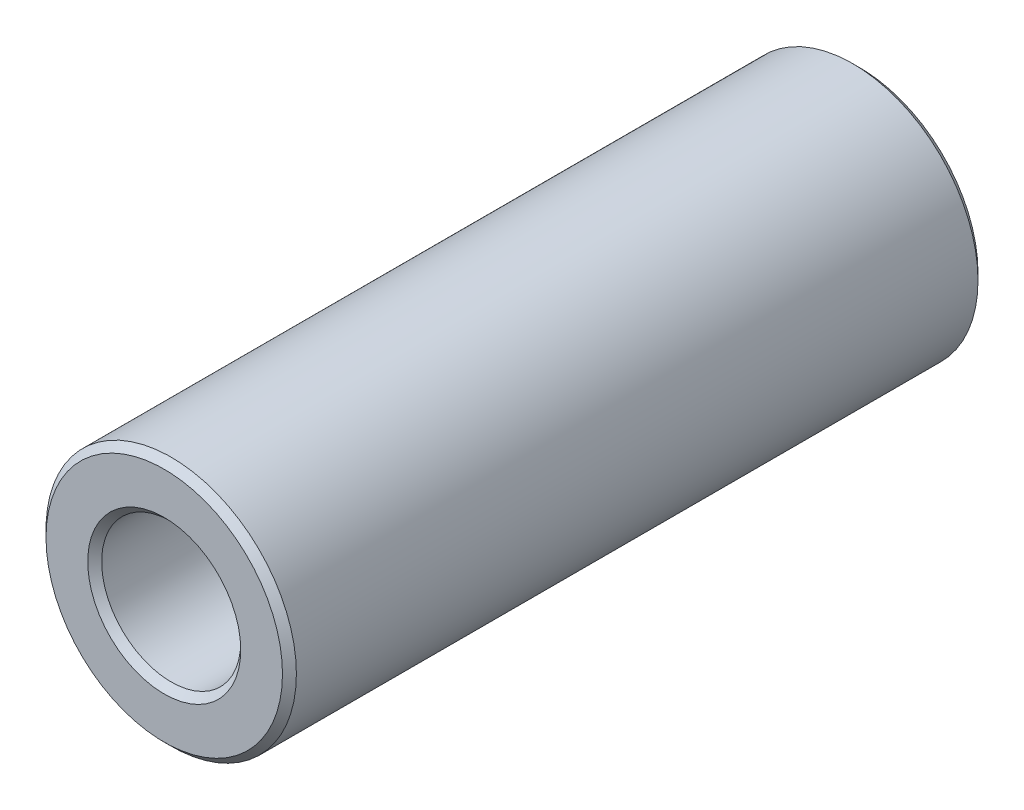
ISO-10303-21;
HEADER;
FILE_DESCRIPTION(('STEP AP214'),'2;1');
FILE_NAME('part.step','',(''),(''),'','','');
FILE_SCHEMA(('AUTOMOTIVE_DESIGN { 1 0 10303 214 1 1 1 1 }'));
ENDSEC;
DATA;
#1=APPLICATION_CONTEXT('core data for automotive mechanical design processes');
#2=APPLICATION_PROTOCOL_DEFINITION('international standard','automotive_design',2000,#1);
#3=PRODUCT_CONTEXT('',#1,'mechanical');
#4=PRODUCT('Part','Part','',(#3));
#5=PRODUCT_RELATED_PRODUCT_CATEGORY('part','',(#4));
#6=PRODUCT_DEFINITION_FORMATION('','',#4);
#7=PRODUCT_DEFINITION_CONTEXT('part definition',#1,'design');
#8=PRODUCT_DEFINITION('design','',#6,#7);
#9=PRODUCT_DEFINITION_SHAPE('','',#8);
#10=(LENGTH_UNIT() NAMED_UNIT(*) SI_UNIT(.MILLI.,.METRE.));
#11=(NAMED_UNIT(*) PLANE_ANGLE_UNIT() SI_UNIT($,.RADIAN.));
#12=(NAMED_UNIT(*) SI_UNIT($,.STERADIAN.) SOLID_ANGLE_UNIT());
#13=UNCERTAINTY_MEASURE_WITH_UNIT(LENGTH_MEASURE(1.E-05),#10,'distance_accuracy_value','');
#14=(GEOMETRIC_REPRESENTATION_CONTEXT(3) GLOBAL_UNCERTAINTY_ASSIGNED_CONTEXT((#13)) GLOBAL_UNIT_ASSIGNED_CONTEXT((#10,
#11,#12)) REPRESENTATION_CONTEXT('',''));
#15=CARTESIAN_POINT('',(0.,0.,0.));
#16=DIRECTION('',(0.,0.,1.));
#17=DIRECTION('',(1.,0.,0.));
#18=AXIS2_PLACEMENT_3D('',#15,#16,#17);
#19=CARTESIAN_POINT('',(0.,0.,50.));
#20=DIRECTION('',(0.,0.,1.));
#21=DIRECTION('',(1.,0.,0.));
#22=AXIS2_PLACEMENT_3D('',#19,#20,#21);
#23=PLANE('',#22);
#24=CARTESIAN_POINT('',(0.,0.,50.));
#25=DIRECTION('',(0.,0.,1.));
#26=DIRECTION('',(1.,0.,0.));
#27=AXIS2_PLACEMENT_3D('',#24,#25,#26);
#28=CIRCLE('',#27,8.50000000000003);
#29=CARTESIAN_POINT('',(8.50000000000003,0.,50.));
#30=VERTEX_POINT('',#29);
#31=EDGE_CURVE('E57',#30,#30,#28,.T.);
#32=ORIENTED_EDGE('',*,*,#31,.T.);
#33=EDGE_LOOP('',(#32));
#34=FACE_BOUND('',#33,.T.);
#35=CARTESIAN_POINT('',(0.,0.,50.));
#36=DIRECTION('',(0.,0.,1.));
#37=DIRECTION('',(1.,0.,0.));
#38=AXIS2_PLACEMENT_3D('',#35,#36,#37);
#39=CIRCLE('',#38,5.50000000000001);
#40=CARTESIAN_POINT('',(5.50000000000001,0.,50.));
#41=VERTEX_POINT('',#40);
#42=EDGE_CURVE('E62',#41,#41,#39,.F.);
#43=ORIENTED_EDGE('',*,*,#42,.T.);
#44=EDGE_LOOP('',(#43));
#45=FACE_BOUND('',#44,.T.);
#46=ADVANCED_FACE('F43',(#34,#45),#23,.T.);
#47=CARTESIAN_POINT('',(0.,0.,0.));
#48=DIRECTION('',(0.,0.,1.));
#49=DIRECTION('',(1.,0.,0.));
#50=AXIS2_PLACEMENT_3D('',#47,#48,#49);
#51=PLANE('',#50);
#52=CARTESIAN_POINT('',(0.,0.,0.));
#53=DIRECTION('',(0.,0.,1.));
#54=DIRECTION('',(1.,0.,0.));
#55=AXIS2_PLACEMENT_3D('',#52,#53,#54);
#56=CIRCLE('',#55,8.5);
#57=CARTESIAN_POINT('',(8.5,0.,0.));
#58=VERTEX_POINT('',#57);
#59=EDGE_CURVE('E68',#58,#58,#56,.F.);
#60=ORIENTED_EDGE('',*,*,#59,.T.);
#61=EDGE_LOOP('',(#60));
#62=FACE_BOUND('',#61,.T.);
#63=CARTESIAN_POINT('',(0.,0.,0.));
#64=DIRECTION('',(0.,0.,1.));
#65=DIRECTION('',(1.,0.,0.));
#66=AXIS2_PLACEMENT_3D('',#63,#64,#65);
#67=CIRCLE('',#66,5.49999999999999);
#68=CARTESIAN_POINT('',(5.49999999999999,0.,0.));
#69=VERTEX_POINT('',#68);
#70=EDGE_CURVE('E72',#69,#69,#67,.T.);
#71=ORIENTED_EDGE('',*,*,#70,.T.);
#72=EDGE_LOOP('',(#71));
#73=FACE_BOUND('',#72,.T.);
#74=ADVANCED_FACE('F97',(#62,#73),#51,.F.);
#75=CARTESIAN_POINT('',(0.,0.,50.));
#76=DIRECTION('',(0.,0.,-1.));
#77=DIRECTION('',(-1.,0.,0.));
#78=AXIS2_PLACEMENT_3D('',#75,#76,#77);
#79=CYLINDRICAL_SURFACE('',#78,9.);
#80=CARTESIAN_POINT('',(0.,0.,0.499999999999994));
#81=DIRECTION('',(0.,0.,1.));
#82=DIRECTION('',(1.,0.,0.));
#83=AXIS2_PLACEMENT_3D('',#80,#81,#82);
#84=CIRCLE('',#83,9.);
#85=CARTESIAN_POINT('',(9.,0.,0.499999999999994));
#86=VERTEX_POINT('',#85);
#87=EDGE_CURVE('E76',#86,#86,#84,.T.);
#88=ORIENTED_EDGE('',*,*,#87,.T.);
#89=EDGE_LOOP('',(#88));
#90=FACE_BOUND('',#89,.T.);
#91=CARTESIAN_POINT('',(0.,0.,49.5));
#92=DIRECTION('',(0.,0.,1.));
#93=DIRECTION('',(1.,0.,0.));
#94=AXIS2_PLACEMENT_3D('',#91,#92,#93);
#95=CIRCLE('',#94,9.);
#96=CARTESIAN_POINT('',(9.,0.,49.5));
#97=VERTEX_POINT('',#96);
#98=EDGE_CURVE('E80',#97,#97,#95,.F.);
#99=ORIENTED_EDGE('',*,*,#98,.T.);
#100=EDGE_LOOP('',(#99));
#101=FACE_BOUND('',#100,.T.);
#102=ADVANCED_FACE('F85',(#90,#101),#79,.T.);
#103=CARTESIAN_POINT('',(0.,0.,50.));
#104=DIRECTION('',(0.,0.,-1.));
#105=DIRECTION('',(-1.,0.,0.));
#106=AXIS2_PLACEMENT_3D('',#103,#104,#105);
#107=CYLINDRICAL_SURFACE('',#106,5.);
#108=CARTESIAN_POINT('',(0.,0.,0.499999999999994));
#109=DIRECTION('',(0.,0.,1.));
#110=DIRECTION('',(1.,0.,0.));
#111=AXIS2_PLACEMENT_3D('',#108,#109,#110);
#112=CIRCLE('',#111,5.);
#113=CARTESIAN_POINT('',(5.,0.,0.499999999999994));
#114=VERTEX_POINT('',#113);
#115=EDGE_CURVE('E10',#114,#114,#112,.F.);
#116=ORIENTED_EDGE('',*,*,#115,.T.);
#117=EDGE_LOOP('',(#116));
#118=FACE_BOUND('',#117,.T.);
#119=CARTESIAN_POINT('',(0.,0.,49.5));
#120=DIRECTION('',(0.,0.,1.));
#121=DIRECTION('',(1.,0.,0.));
#122=AXIS2_PLACEMENT_3D('',#119,#120,#121);
#123=CIRCLE('',#122,5.);
#124=CARTESIAN_POINT('',(5.,0.,49.5));
#125=VERTEX_POINT('',#124);
#126=EDGE_CURVE('E52',#125,#125,#123,.T.);
#127=ORIENTED_EDGE('',*,*,#126,.T.);
#128=EDGE_LOOP('',(#127));
#129=FACE_BOUND('',#128,.T.);
#130=ADVANCED_FACE('F122',(#118,#129),#107,.F.);
#131=CARTESIAN_POINT('',(0.,0.,0.499999999999994));
#132=DIRECTION('',(0.,0.,1.));
#133=DIRECTION('',(1.,0.,0.));
#134=AXIS2_PLACEMENT_3D('',#131,#132,#133);
#135=CONICAL_SURFACE('',#134,9.,0.78539816339745);
#136=ORIENTED_EDGE('',*,*,#59,.F.);
#137=EDGE_LOOP('',(#136));
#138=FACE_BOUND('',#137,.T.);
#139=ORIENTED_EDGE('',*,*,#87,.F.);
#140=EDGE_LOOP('',(#139));
#141=FACE_BOUND('',#140,.T.);
#142=ADVANCED_FACE('F91',(#138,#141),#135,.T.);
#143=CARTESIAN_POINT('',(0.,0.,50.));
#144=DIRECTION('',(0.,0.,-1.));
#145=DIRECTION('',(-1.,0.,0.));
#146=AXIS2_PLACEMENT_3D('',#143,#144,#145);
#147=CONICAL_SURFACE('',#146,8.50000000000003,0.785398163397447);
#148=ORIENTED_EDGE('',*,*,#98,.F.);
#149=EDGE_LOOP('',(#148));
#150=FACE_BOUND('',#149,.T.);
#151=ORIENTED_EDGE('',*,*,#31,.F.);
#152=EDGE_LOOP('',(#151));
#153=FACE_BOUND('',#152,.T.);
#154=ADVANCED_FACE('F87',(#150,#153),#147,.T.);
#155=CARTESIAN_POINT('',(0.,0.,0.));
#156=DIRECTION('',(0.,0.,-1.));
#157=DIRECTION('',(-1.,0.,0.));
#158=AXIS2_PLACEMENT_3D('',#155,#156,#157);
#159=CONICAL_SURFACE('',#158,5.49999999999999,0.785398163397447);
#160=ORIENTED_EDGE('',*,*,#115,.F.);
#161=EDGE_LOOP('',(#160));
#162=FACE_BOUND('',#161,.T.);
#163=ORIENTED_EDGE('',*,*,#70,.F.);
#164=EDGE_LOOP('',(#163));
#165=FACE_BOUND('',#164,.T.);
#166=ADVANCED_FACE('F90',(#162,#165),#159,.F.);
#167=CARTESIAN_POINT('',(0.,0.,49.5));
#168=DIRECTION('',(0.,0.,1.));
#169=DIRECTION('',(1.,0.,0.));
#170=AXIS2_PLACEMENT_3D('',#167,#168,#169);
#171=CONICAL_SURFACE('',#170,5.,0.785398163397447);
#172=ORIENTED_EDGE('',*,*,#42,.F.);
#173=EDGE_LOOP('',(#172));
#174=FACE_BOUND('',#173,.T.);
#175=ORIENTED_EDGE('',*,*,#126,.F.);
#176=EDGE_LOOP('',(#175));
#177=FACE_BOUND('',#176,.T.);
#178=ADVANCED_FACE('F46',(#174,#177),#171,.F.);
#179=CLOSED_SHELL('',(#46,#74,#102,#130,#142,#154,#166,#178));
#180=MANIFOLD_SOLID_BREP('B2',#179);
#181=ADVANCED_BREP_SHAPE_REPRESENTATION('',(#18,#180),#14);
#182=SHAPE_DEFINITION_REPRESENTATION(#9,#181);
ENDSEC;
END-ISO-10303-21;
